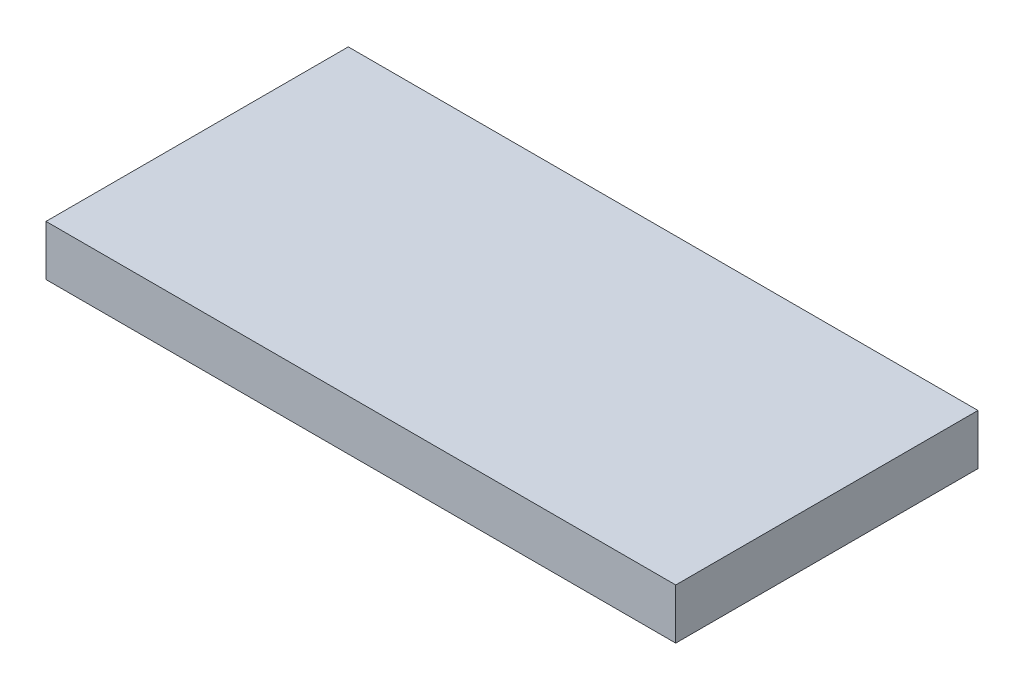
ISO-10303-21;
HEADER;
FILE_DESCRIPTION(('STEP AP214'),'2;1');
FILE_NAME('part.step','',(''),(''),'','','');
FILE_SCHEMA(('AUTOMOTIVE_DESIGN { 1 0 10303 214 1 1 1 1 }'));
ENDSEC;
DATA;
#1=APPLICATION_CONTEXT('core data for automotive mechanical design processes');
#2=APPLICATION_PROTOCOL_DEFINITION('international standard','automotive_design',2000,#1);
#3=PRODUCT_CONTEXT('',#1,'mechanical');
#4=PRODUCT('Part','Part','',(#3));
#5=PRODUCT_RELATED_PRODUCT_CATEGORY('part','',(#4));
#6=PRODUCT_DEFINITION_FORMATION('','',#4);
#7=PRODUCT_DEFINITION_CONTEXT('part definition',#1,'design');
#8=PRODUCT_DEFINITION('design','',#6,#7);
#9=PRODUCT_DEFINITION_SHAPE('','',#8);
#10=(LENGTH_UNIT() NAMED_UNIT(*) SI_UNIT(.MILLI.,.METRE.));
#11=(NAMED_UNIT(*) PLANE_ANGLE_UNIT() SI_UNIT($,.RADIAN.));
#12=(NAMED_UNIT(*) SI_UNIT($,.STERADIAN.) SOLID_ANGLE_UNIT());
#13=UNCERTAINTY_MEASURE_WITH_UNIT(LENGTH_MEASURE(1.E-05),#10,'distance_accuracy_value','');
#14=(GEOMETRIC_REPRESENTATION_CONTEXT(3) GLOBAL_UNCERTAINTY_ASSIGNED_CONTEXT((#13)) GLOBAL_UNIT_ASSIGNED_CONTEXT((#10,
#11,#12)) REPRESENTATION_CONTEXT('',''));
#15=CARTESIAN_POINT('',(0.,0.,0.));
#16=DIRECTION('',(0.,0.,1.));
#17=DIRECTION('',(1.,0.,0.));
#18=AXIS2_PLACEMENT_3D('',#15,#16,#17);
#19=CARTESIAN_POINT('',(-125.,20.,60.));
#20=DIRECTION('',(1.,0.,0.));
#21=DIRECTION('',(0.,0.,-1.));
#22=AXIS2_PLACEMENT_3D('',#19,#20,#21);
#23=PLANE('',#22);
#24=DIRECTION('',(0.,0.,1.));
#25=VECTOR('',#24,1.);
#26=CARTESIAN_POINT('',(-125.,0.,60.));
#27=LINE('',#26,#25);
#28=CARTESIAN_POINT('',(-125.,0.,-60.));
#29=VERTEX_POINT('',#28);
#30=CARTESIAN_POINT('',(-125.,0.,60.));
#31=VERTEX_POINT('',#30);
#32=EDGE_CURVE('E97',#29,#31,#27,.T.);
#33=ORIENTED_EDGE('',*,*,#32,.T.);
#34=DIRECTION('',(0.,-1.,0.));
#35=VECTOR('',#34,1.);
#36=CARTESIAN_POINT('',(-125.,20.,60.));
#37=LINE('',#36,#35);
#38=CARTESIAN_POINT('',(-125.,20.,60.));
#39=VERTEX_POINT('',#38);
#40=EDGE_CURVE('E11',#39,#31,#37,.T.);
#41=ORIENTED_EDGE('',*,*,#40,.F.);
#42=DIRECTION('',(0.,0.,1.));
#43=VECTOR('',#42,1.);
#44=CARTESIAN_POINT('',(-125.,20.,60.));
#45=LINE('',#44,#43);
#46=CARTESIAN_POINT('',(-125.,20.,-60.));
#47=VERTEX_POINT('',#46);
#48=EDGE_CURVE('E85',#47,#39,#45,.T.);
#49=ORIENTED_EDGE('',*,*,#48,.F.);
#50=DIRECTION('',(0.,-1.,0.));
#51=VECTOR('',#50,1.);
#52=CARTESIAN_POINT('',(-125.,20.,-60.));
#53=LINE('',#52,#51);
#54=EDGE_CURVE('E93',#47,#29,#53,.T.);
#55=ORIENTED_EDGE('',*,*,#54,.T.);
#56=EDGE_LOOP('',(#33,#41,#49,#55));
#57=FACE_BOUND('',#56,.T.);
#58=ADVANCED_FACE('F34',(#57),#23,.F.);
#59=CARTESIAN_POINT('',(125.,20.,60.));
#60=DIRECTION('',(0.,0.,-1.));
#61=DIRECTION('',(-1.,0.,0.));
#62=AXIS2_PLACEMENT_3D('',#59,#60,#61);
#63=PLANE('',#62);
#64=DIRECTION('',(1.,0.,0.));
#65=VECTOR('',#64,1.);
#66=CARTESIAN_POINT('',(125.,0.,60.));
#67=LINE('',#66,#65);
#68=CARTESIAN_POINT('',(125.,0.,60.));
#69=VERTEX_POINT('',#68);
#70=EDGE_CURVE('E89',#31,#69,#67,.T.);
#71=ORIENTED_EDGE('',*,*,#70,.T.);
#72=DIRECTION('',(0.,-1.,0.));
#73=VECTOR('',#72,1.);
#74=CARTESIAN_POINT('',(125.,20.,60.));
#75=LINE('',#74,#73);
#76=CARTESIAN_POINT('',(125.,20.,60.));
#77=VERTEX_POINT('',#76);
#78=EDGE_CURVE('E42',#77,#69,#75,.T.);
#79=ORIENTED_EDGE('',*,*,#78,.F.);
#80=DIRECTION('',(1.,0.,0.));
#81=VECTOR('',#80,1.);
#82=CARTESIAN_POINT('',(125.,20.,60.));
#83=LINE('',#82,#81);
#84=EDGE_CURVE('E80',#39,#77,#83,.T.);
#85=ORIENTED_EDGE('',*,*,#84,.F.);
#86=ORIENTED_EDGE('',*,*,#40,.T.);
#87=EDGE_LOOP('',(#71,#79,#85,#86));
#88=FACE_BOUND('',#87,.T.);
#89=ADVANCED_FACE('F88',(#88),#63,.F.);
#90=CARTESIAN_POINT('',(125.,20.,60.));
#91=DIRECTION('',(-1.,0.,0.));
#92=DIRECTION('',(0.,0.,1.));
#93=AXIS2_PLACEMENT_3D('',#90,#91,#92);
#94=PLANE('',#93);
#95=DIRECTION('',(0.,0.,-1.));
#96=VECTOR('',#95,1.);
#97=CARTESIAN_POINT('',(125.,0.,60.));
#98=LINE('',#97,#96);
#99=CARTESIAN_POINT('',(125.,0.,-60.));
#100=VERTEX_POINT('',#99);
#101=EDGE_CURVE('E67',#69,#100,#98,.T.);
#102=ORIENTED_EDGE('',*,*,#101,.T.);
#103=DIRECTION('',(0.,-1.,0.));
#104=VECTOR('',#103,1.);
#105=CARTESIAN_POINT('',(125.,20.,-60.));
#106=LINE('',#105,#104);
#107=CARTESIAN_POINT('',(125.,20.,-60.));
#108=VERTEX_POINT('',#107);
#109=EDGE_CURVE('E90',#108,#100,#106,.T.);
#110=ORIENTED_EDGE('',*,*,#109,.F.);
#111=DIRECTION('',(0.,0.,-1.));
#112=VECTOR('',#111,1.);
#113=CARTESIAN_POINT('',(125.,20.,60.));
#114=LINE('',#113,#112);
#115=EDGE_CURVE('E83',#77,#108,#114,.T.);
#116=ORIENTED_EDGE('',*,*,#115,.F.);
#117=ORIENTED_EDGE('',*,*,#78,.T.);
#118=EDGE_LOOP('',(#102,#110,#116,#117));
#119=FACE_BOUND('',#118,.T.);
#120=ADVANCED_FACE('F91',(#119),#94,.F.);
#121=CARTESIAN_POINT('',(125.,20.,-60.));
#122=DIRECTION('',(0.,0.,1.));
#123=DIRECTION('',(1.,0.,0.));
#124=AXIS2_PLACEMENT_3D('',#121,#122,#123);
#125=PLANE('',#124);
#126=DIRECTION('',(-1.,0.,0.));
#127=VECTOR('',#126,1.);
#128=CARTESIAN_POINT('',(125.,0.,-60.));
#129=LINE('',#128,#127);
#130=EDGE_CURVE('E73',#100,#29,#129,.T.);
#131=ORIENTED_EDGE('',*,*,#130,.T.);
#132=ORIENTED_EDGE('',*,*,#54,.F.);
#133=DIRECTION('',(-1.,0.,0.));
#134=VECTOR('',#133,1.);
#135=CARTESIAN_POINT('',(125.,20.,-60.));
#136=LINE('',#135,#134);
#137=EDGE_CURVE('E50',#108,#47,#136,.T.);
#138=ORIENTED_EDGE('',*,*,#137,.F.);
#139=ORIENTED_EDGE('',*,*,#109,.T.);
#140=EDGE_LOOP('',(#131,#132,#138,#139));
#141=FACE_BOUND('',#140,.T.);
#142=ADVANCED_FACE('F104',(#141),#125,.F.);
#143=CARTESIAN_POINT('',(0.,20.,0.));
#144=DIRECTION('',(0.,1.,0.));
#145=DIRECTION('',(0.,0.,1.));
#146=AXIS2_PLACEMENT_3D('',#143,#144,#145);
#147=PLANE('',#146);
#148=ORIENTED_EDGE('',*,*,#48,.T.);
#149=ORIENTED_EDGE('',*,*,#84,.T.);
#150=ORIENTED_EDGE('',*,*,#115,.T.);
#151=ORIENTED_EDGE('',*,*,#137,.T.);
#152=EDGE_LOOP('',(#148,#149,#150,#151));
#153=FACE_BOUND('',#152,.T.);
#154=ADVANCED_FACE('F81',(#153),#147,.T.);
#155=CARTESIAN_POINT('',(0.,0.,0.));
#156=DIRECTION('',(0.,1.,0.));
#157=DIRECTION('',(0.,0.,1.));
#158=AXIS2_PLACEMENT_3D('',#155,#156,#157);
#159=PLANE('',#158);
#160=ORIENTED_EDGE('',*,*,#32,.F.);
#161=ORIENTED_EDGE('',*,*,#130,.F.);
#162=ORIENTED_EDGE('',*,*,#101,.F.);
#163=ORIENTED_EDGE('',*,*,#70,.F.);
#164=EDGE_LOOP('',(#160,#161,#162,#163));
#165=FACE_BOUND('',#164,.T.);
#166=ADVANCED_FACE('F107',(#165),#159,.F.);
#167=CLOSED_SHELL('',(#58,#89,#120,#142,#154,#166));
#168=MANIFOLD_SOLID_BREP('B2',#167);
#169=ADVANCED_BREP_SHAPE_REPRESENTATION('',(#18,#168),#14);
#170=SHAPE_DEFINITION_REPRESENTATION(#9,#169);
ENDSEC;
END-ISO-10303-21;
